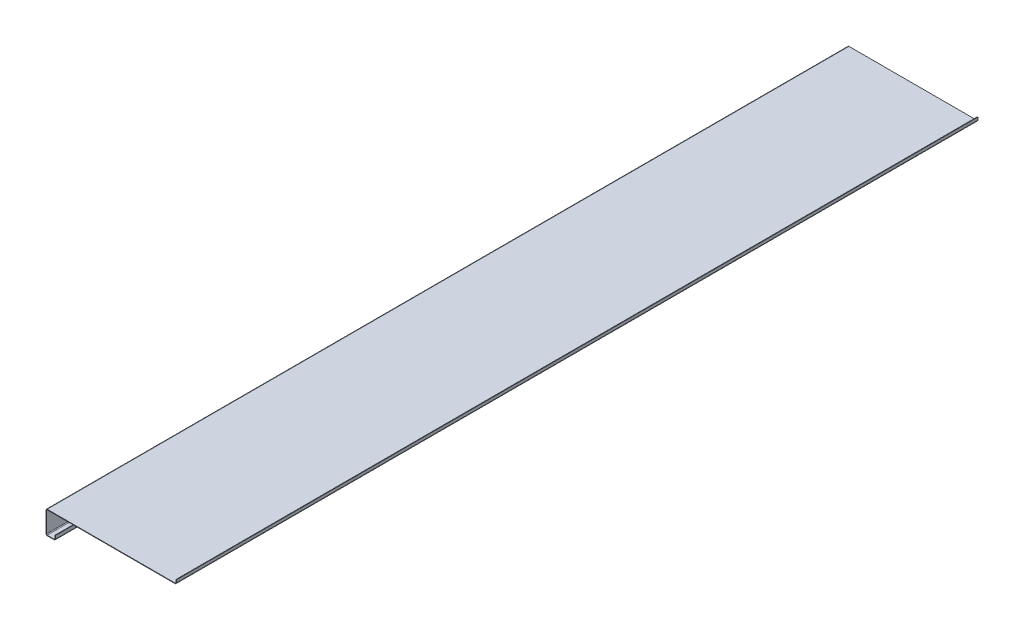
ISO-10303-21;
HEADER;
FILE_DESCRIPTION(('STEP AP214'),'2;1');
FILE_NAME('part.step','',(''),(''),'','','');
FILE_SCHEMA(('AUTOMOTIVE_DESIGN { 1 0 10303 214 1 1 1 1 }'));
ENDSEC;
DATA;
#1=APPLICATION_CONTEXT('core data for automotive mechanical design processes');
#2=APPLICATION_PROTOCOL_DEFINITION('international standard','automotive_design',2000,#1);
#3=PRODUCT_CONTEXT('',#1,'mechanical');
#4=PRODUCT('Part','Part','',(#3));
#5=PRODUCT_RELATED_PRODUCT_CATEGORY('part','',(#4));
#6=PRODUCT_DEFINITION_FORMATION('','',#4);
#7=PRODUCT_DEFINITION_CONTEXT('part definition',#1,'design');
#8=PRODUCT_DEFINITION('design','',#6,#7);
#9=PRODUCT_DEFINITION_SHAPE('','',#8);
#10=(LENGTH_UNIT() NAMED_UNIT(*) SI_UNIT(.MILLI.,.METRE.));
#11=(NAMED_UNIT(*) PLANE_ANGLE_UNIT() SI_UNIT($,.RADIAN.));
#12=(NAMED_UNIT(*) SI_UNIT($,.STERADIAN.) SOLID_ANGLE_UNIT());
#13=UNCERTAINTY_MEASURE_WITH_UNIT(LENGTH_MEASURE(1.E-05),#10,'distance_accuracy_value','');
#14=(GEOMETRIC_REPRESENTATION_CONTEXT(3) GLOBAL_UNCERTAINTY_ASSIGNED_CONTEXT((#13)) GLOBAL_UNIT_ASSIGNED_CONTEXT((#10,
#11,#12)) REPRESENTATION_CONTEXT('',''));
#15=CARTESIAN_POINT('',(0.,0.,0.));
#16=DIRECTION('',(0.,0.,1.));
#17=DIRECTION('',(1.,0.,0.));
#18=AXIS2_PLACEMENT_3D('',#15,#16,#17);
#19=CARTESIAN_POINT('',(-3.25,0.,2080.));
#20=DIRECTION('',(0.,0.,1.));
#21=DIRECTION('',(1.,0.,0.));
#22=AXIS2_PLACEMENT_3D('',#19,#20,#21);
#23=PLANE('',#22);
#24=DIRECTION('',(0.,1.,0.));
#25=VECTOR('',#24,1.);
#26=CARTESIAN_POINT('',(-3.25,0.,2080.));
#27=LINE('',#26,#25);
#28=CARTESIAN_POINT('',(-3.25,0.,2080.));
#29=VERTEX_POINT('',#28);
#30=CARTESIAN_POINT('',(-3.25,1.25,2080.));
#31=VERTEX_POINT('',#30);
#32=EDGE_CURVE('E11',#29,#31,#27,.T.);
#33=ORIENTED_EDGE('',*,*,#32,.F.);
#34=CARTESIAN_POINT('',(-3.25,3.25,2080.));
#35=DIRECTION('',(0.,0.,1.));
#36=DIRECTION('',(1.,0.,0.));
#37=AXIS2_PLACEMENT_3D('',#34,#35,#36);
#38=CIRCLE('',#37,3.25);
#39=CARTESIAN_POINT('',(0.,3.25,2080.));
#40=VERTEX_POINT('',#39);
#41=EDGE_CURVE('E365',#40,#29,#38,.F.);
#42=ORIENTED_EDGE('',*,*,#41,.F.);
#43=DIRECTION('',(1.,0.,0.));
#44=VECTOR('',#43,1.);
#45=CARTESIAN_POINT('',(-1.25,3.25,2080.));
#46=LINE('',#45,#44);
#47=CARTESIAN_POINT('',(-1.25,3.25,2080.));
#48=VERTEX_POINT('',#47);
#49=EDGE_CURVE('E44',#48,#40,#46,.T.);
#50=ORIENTED_EDGE('',*,*,#49,.F.);
#51=CARTESIAN_POINT('',(-3.25,3.25,2080.));
#52=DIRECTION('',(0.,0.,1.));
#53=DIRECTION('',(1.,0.,0.));
#54=AXIS2_PLACEMENT_3D('',#51,#52,#53);
#55=CIRCLE('',#54,2.);
#56=EDGE_CURVE('E378',#48,#31,#55,.F.);
#57=ORIENTED_EDGE('',*,*,#56,.T.);
#58=EDGE_LOOP('',(#33,#42,#50,#57));
#59=FACE_BOUND('',#58,.T.);
#60=ADVANCED_FACE('F36',(#59),#23,.T.);
#61=CARTESIAN_POINT('',(-1.25,3.25,2080.));
#62=DIRECTION('',(0.,0.,1.));
#63=DIRECTION('',(1.,0.,0.));
#64=AXIS2_PLACEMENT_3D('',#61,#62,#63);
#65=PLANE('',#64);
#66=DIRECTION('',(-1.,0.,0.));
#67=VECTOR('',#66,1.);
#68=CARTESIAN_POINT('',(0.,0.,2080.));
#69=LINE('',#68,#67);
#70=CARTESIAN_POINT('',(-334.75,0.,2080.));
#71=VERTEX_POINT('',#70);
#72=EDGE_CURVE('E369',#29,#71,#69,.T.);
#73=ORIENTED_EDGE('',*,*,#72,.F.);
#74=ORIENTED_EDGE('',*,*,#32,.T.);
#75=DIRECTION('',(-1.,0.,0.));
#76=VECTOR('',#75,1.);
#77=CARTESIAN_POINT('',(0.,1.25,2080.));
#78=LINE('',#77,#76);
#79=CARTESIAN_POINT('',(-334.75,1.24999999999996,2080.));
#80=VERTEX_POINT('',#79);
#81=EDGE_CURVE('E380',#31,#80,#78,.T.);
#82=ORIENTED_EDGE('',*,*,#81,.T.);
#83=DIRECTION('',(0.,-1.,0.));
#84=VECTOR('',#83,1.);
#85=CARTESIAN_POINT('',(-334.75,1.24999999999996,2080.));
#86=LINE('',#85,#84);
#87=EDGE_CURVE('E339',#80,#71,#86,.T.);
#88=ORIENTED_EDGE('',*,*,#87,.T.);
#89=EDGE_LOOP('',(#73,#74,#82,#88));
#90=FACE_BOUND('',#89,.T.);
#91=ADVANCED_FACE('F449',(#90),#65,.T.);
#92=CARTESIAN_POINT('',(0.,3.25,0.));
#93=DIRECTION('',(0.,0.,-1.));
#94=DIRECTION('',(-1.,0.,0.));
#95=AXIS2_PLACEMENT_3D('',#92,#93,#94);
#96=PLANE('',#95);
#97=DIRECTION('',(-1.,0.,0.));
#98=VECTOR('',#97,1.);
#99=CARTESIAN_POINT('',(0.,3.25,0.));
#100=LINE('',#99,#98);
#101=CARTESIAN_POINT('',(0.,3.25,0.));
#102=VERTEX_POINT('',#101);
#103=CARTESIAN_POINT('',(-1.25,3.25,0.));
#104=VERTEX_POINT('',#103);
#105=EDGE_CURVE('E345',#102,#104,#100,.T.);
#106=ORIENTED_EDGE('',*,*,#105,.F.);
#107=CARTESIAN_POINT('',(-3.25,3.25,0.));
#108=DIRECTION('',(0.,0.,1.));
#109=DIRECTION('',(1.,0.,0.));
#110=AXIS2_PLACEMENT_3D('',#107,#108,#109);
#111=CIRCLE('',#110,3.25);
#112=CARTESIAN_POINT('',(-3.25,0.,0.));
#113=VERTEX_POINT('',#112);
#114=EDGE_CURVE('E249',#102,#113,#111,.F.);
#115=ORIENTED_EDGE('',*,*,#114,.T.);
#116=DIRECTION('',(0.,-1.,0.));
#117=VECTOR('',#116,1.);
#118=CARTESIAN_POINT('',(-3.25,1.25,0.));
#119=LINE('',#118,#117);
#120=CARTESIAN_POINT('',(-3.25,1.25,0.));
#121=VERTEX_POINT('',#120);
#122=EDGE_CURVE('E343',#121,#113,#119,.T.);
#123=ORIENTED_EDGE('',*,*,#122,.F.);
#124=CARTESIAN_POINT('',(-3.25,3.25,0.));
#125=DIRECTION('',(0.,0.,1.));
#126=DIRECTION('',(1.,0.,0.));
#127=AXIS2_PLACEMENT_3D('',#124,#125,#126);
#128=CIRCLE('',#127,2.);
#129=EDGE_CURVE('E261',#104,#121,#128,.F.);
#130=ORIENTED_EDGE('',*,*,#129,.F.);
#131=EDGE_LOOP('',(#106,#115,#123,#130));
#132=FACE_BOUND('',#131,.T.);
#133=ADVANCED_FACE('F491',(#132),#96,.T.);
#134=CARTESIAN_POINT('',(-3.25,1.25,0.));
#135=DIRECTION('',(0.,0.,-1.));
#136=DIRECTION('',(-1.,0.,0.));
#137=AXIS2_PLACEMENT_3D('',#134,#135,#136);
#138=PLANE('',#137);
#139=DIRECTION('',(0.,-1.,0.));
#140=VECTOR('',#139,1.);
#141=CARTESIAN_POINT('',(0.,10.,0.));
#142=LINE('',#141,#140);
#143=CARTESIAN_POINT('',(0.,10.,0.));
#144=VERTEX_POINT('',#143);
#145=EDGE_CURVE('E252',#144,#102,#142,.T.);
#146=ORIENTED_EDGE('',*,*,#145,.T.);
#147=ORIENTED_EDGE('',*,*,#105,.T.);
#148=DIRECTION('',(0.,-1.,0.));
#149=VECTOR('',#148,1.);
#150=CARTESIAN_POINT('',(-1.25,10.,0.));
#151=LINE('',#150,#149);
#152=CARTESIAN_POINT('',(-1.25,10.,0.));
#153=VERTEX_POINT('',#152);
#154=EDGE_CURVE('E258',#153,#104,#151,.T.);
#155=ORIENTED_EDGE('',*,*,#154,.F.);
#156=DIRECTION('',(1.,0.,0.));
#157=VECTOR('',#156,1.);
#158=CARTESIAN_POINT('',(-1.25,10.,0.));
#159=LINE('',#158,#157);
#160=EDGE_CURVE('E255',#153,#144,#159,.T.);
#161=ORIENTED_EDGE('',*,*,#160,.T.);
#162=EDGE_LOOP('',(#146,#147,#155,#161));
#163=FACE_BOUND('',#162,.T.);
#164=ADVANCED_FACE('F495',(#163),#138,.T.);
#165=CARTESIAN_POINT('',(-336.75,-2.00000000000004,2080.));
#166=DIRECTION('',(0.,0.,1.));
#167=DIRECTION('',(1.,0.,0.));
#168=AXIS2_PLACEMENT_3D('',#165,#166,#167);
#169=PLANE('',#168);
#170=DIRECTION('',(-1.,0.,0.));
#171=VECTOR('',#170,1.);
#172=CARTESIAN_POINT('',(-336.75,-2.00000000000004,2080.));
#173=LINE('',#172,#171);
#174=CARTESIAN_POINT('',(-336.75,-2.00000000000004,2080.));
#175=VERTEX_POINT('',#174);
#176=CARTESIAN_POINT('',(-338.,-2.00000000000004,2080.));
#177=VERTEX_POINT('',#176);
#178=EDGE_CURVE('E341',#175,#177,#173,.T.);
#179=ORIENTED_EDGE('',*,*,#178,.F.);
#180=CARTESIAN_POINT('',(-334.75,-2.00000000000004,2080.));
#181=DIRECTION('',(0.,0.,-1.));
#182=DIRECTION('',(-1.,0.,0.));
#183=AXIS2_PLACEMENT_3D('',#180,#181,#182);
#184=CIRCLE('',#183,2.);
#185=EDGE_CURVE('E439',#71,#175,#184,.F.);
#186=ORIENTED_EDGE('',*,*,#185,.F.);
#187=ORIENTED_EDGE('',*,*,#87,.F.);
#188=CARTESIAN_POINT('',(-334.75,-2.00000000000004,2080.));
#189=DIRECTION('',(0.,0.,1.));
#190=DIRECTION('',(1.,0.,0.));
#191=AXIS2_PLACEMENT_3D('',#188,#189,#190);
#192=CIRCLE('',#191,3.25);
#193=EDGE_CURVE('E383',#80,#177,#192,.T.);
#194=ORIENTED_EDGE('',*,*,#193,.T.);
#195=EDGE_LOOP('',(#179,#186,#187,#194));
#196=FACE_BOUND('',#195,.T.);
#197=ADVANCED_FACE('F456',(#196),#169,.T.);
#198=CARTESIAN_POINT('',(-334.75,1.24999999999996,2080.));
#199=DIRECTION('',(0.,0.,1.));
#200=DIRECTION('',(1.,0.,0.));
#201=AXIS2_PLACEMENT_3D('',#198,#199,#200);
#202=PLANE('',#201);
#203=DIRECTION('',(0.,-1.,0.));
#204=VECTOR('',#203,1.);
#205=CARTESIAN_POINT('',(-336.75,0.,2080.));
#206=LINE('',#205,#204);
#207=CARTESIAN_POINT('',(-336.75,-55.,2080.));
#208=VERTEX_POINT('',#207);
#209=EDGE_CURVE('E436',#175,#208,#206,.T.);
#210=ORIENTED_EDGE('',*,*,#209,.F.);
#211=ORIENTED_EDGE('',*,*,#178,.T.);
#212=DIRECTION('',(0.,-1.,0.));
#213=VECTOR('',#212,1.);
#214=CARTESIAN_POINT('',(-338.,0.,2080.));
#215=LINE('',#214,#213);
#216=CARTESIAN_POINT('',(-338.,-55.,2080.));
#217=VERTEX_POINT('',#216);
#218=EDGE_CURVE('E203',#177,#217,#215,.T.);
#219=ORIENTED_EDGE('',*,*,#218,.T.);
#220=DIRECTION('',(1.,0.,0.));
#221=VECTOR('',#220,1.);
#222=CARTESIAN_POINT('',(-338.,-55.,2080.));
#223=LINE('',#222,#221);
#224=EDGE_CURVE('E194',#217,#208,#223,.T.);
#225=ORIENTED_EDGE('',*,*,#224,.T.);
#226=EDGE_LOOP('',(#210,#211,#219,#225));
#227=FACE_BOUND('',#226,.T.);
#228=ADVANCED_FACE('F389',(#227),#202,.T.);
#229=CARTESIAN_POINT('',(-334.75,0.,0.));
#230=DIRECTION('',(0.,0.,-1.));
#231=DIRECTION('',(-1.,0.,0.));
#232=AXIS2_PLACEMENT_3D('',#229,#230,#231);
#233=PLANE('',#232);
#234=DIRECTION('',(0.,1.,0.));
#235=VECTOR('',#234,1.);
#236=CARTESIAN_POINT('',(-334.75,0.,0.));
#237=LINE('',#236,#235);
#238=CARTESIAN_POINT('',(-334.75,0.,0.));
#239=VERTEX_POINT('',#238);
#240=CARTESIAN_POINT('',(-334.75,1.24999999999996,0.));
#241=VERTEX_POINT('',#240);
#242=EDGE_CURVE('E337',#239,#241,#237,.T.);
#243=ORIENTED_EDGE('',*,*,#242,.F.);
#244=CARTESIAN_POINT('',(-334.75,-2.00000000000004,0.));
#245=DIRECTION('',(0.,0.,-1.));
#246=DIRECTION('',(-1.,0.,0.));
#247=AXIS2_PLACEMENT_3D('',#244,#245,#246);
#248=CIRCLE('',#247,2.);
#249=CARTESIAN_POINT('',(-336.75,-2.00000000000004,0.));
#250=VERTEX_POINT('',#249);
#251=EDGE_CURVE('E243',#239,#250,#248,.F.);
#252=ORIENTED_EDGE('',*,*,#251,.T.);
#253=DIRECTION('',(1.,0.,0.));
#254=VECTOR('',#253,1.);
#255=CARTESIAN_POINT('',(-338.,-2.00000000000004,0.));
#256=LINE('',#255,#254);
#257=CARTESIAN_POINT('',(-338.,-2.00000000000004,0.));
#258=VERTEX_POINT('',#257);
#259=EDGE_CURVE('E193',#258,#250,#256,.T.);
#260=ORIENTED_EDGE('',*,*,#259,.F.);
#261=CARTESIAN_POINT('',(-334.75,-2.00000000000004,0.));
#262=DIRECTION('',(0.,0.,1.));
#263=DIRECTION('',(1.,0.,0.));
#264=AXIS2_PLACEMENT_3D('',#261,#262,#263);
#265=CIRCLE('',#264,3.25);
#266=EDGE_CURVE('E267',#241,#258,#265,.T.);
#267=ORIENTED_EDGE('',*,*,#266,.F.);
#268=EDGE_LOOP('',(#243,#252,#260,#267));
#269=FACE_BOUND('',#268,.T.);
#270=ADVANCED_FACE('F465',(#269),#233,.T.);
#271=CARTESIAN_POINT('',(-338.,-2.00000000000004,0.));
#272=DIRECTION('',(0.,0.,-1.));
#273=DIRECTION('',(-1.,0.,0.));
#274=AXIS2_PLACEMENT_3D('',#271,#272,#273);
#275=PLANE('',#274);
#276=DIRECTION('',(-1.,0.,0.));
#277=VECTOR('',#276,1.);
#278=CARTESIAN_POINT('',(0.,0.,0.));
#279=LINE('',#278,#277);
#280=EDGE_CURVE('E246',#113,#239,#279,.T.);
#281=ORIENTED_EDGE('',*,*,#280,.T.);
#282=ORIENTED_EDGE('',*,*,#242,.T.);
#283=DIRECTION('',(-1.,0.,0.));
#284=VECTOR('',#283,1.);
#285=CARTESIAN_POINT('',(0.,1.25,0.));
#286=LINE('',#285,#284);
#287=EDGE_CURVE('E264',#121,#241,#286,.T.);
#288=ORIENTED_EDGE('',*,*,#287,.F.);
#289=ORIENTED_EDGE('',*,*,#122,.T.);
#290=EDGE_LOOP('',(#281,#282,#288,#289));
#291=FACE_BOUND('',#290,.T.);
#292=ADVANCED_FACE('F469',(#291),#275,.T.);
#293=CARTESIAN_POINT('',(-334.75,-57.,2080.));
#294=DIRECTION('',(0.,0.,1.));
#295=DIRECTION('',(1.,0.,0.));
#296=AXIS2_PLACEMENT_3D('',#293,#294,#295);
#297=PLANE('',#296);
#298=DIRECTION('',(0.,-1.,0.));
#299=VECTOR('',#298,1.);
#300=CARTESIAN_POINT('',(-334.75,-57.,2080.));
#301=LINE('',#300,#299);
#302=CARTESIAN_POINT('',(-334.75,-57.,2080.));
#303=VERTEX_POINT('',#302);
#304=CARTESIAN_POINT('',(-334.75,-58.25,2080.));
#305=VERTEX_POINT('',#304);
#306=EDGE_CURVE('E181',#303,#305,#301,.T.);
#307=ORIENTED_EDGE('',*,*,#306,.F.);
#308=CARTESIAN_POINT('',(-334.75,-55.,2080.));
#309=DIRECTION('',(0.,0.,-1.));
#310=DIRECTION('',(-1.,0.,0.));
#311=AXIS2_PLACEMENT_3D('',#308,#309,#310);
#312=CIRCLE('',#311,2.);
#313=EDGE_CURVE('E401',#208,#303,#312,.F.);
#314=ORIENTED_EDGE('',*,*,#313,.F.);
#315=ORIENTED_EDGE('',*,*,#224,.F.);
#316=CARTESIAN_POINT('',(-334.75,-55.,2080.));
#317=DIRECTION('',(0.,0.,1.));
#318=DIRECTION('',(1.,0.,0.));
#319=AXIS2_PLACEMENT_3D('',#316,#317,#318);
#320=CIRCLE('',#319,3.25);
#321=EDGE_CURVE('E197',#217,#305,#320,.T.);
#322=ORIENTED_EDGE('',*,*,#321,.T.);
#323=EDGE_LOOP('',(#307,#314,#315,#322));
#324=FACE_BOUND('',#323,.T.);
#325=ADVANCED_FACE('F199',(#324),#297,.T.);
#326=CARTESIAN_POINT('',(-338.,-55.,2080.));
#327=DIRECTION('',(0.,0.,1.));
#328=DIRECTION('',(1.,0.,0.));
#329=AXIS2_PLACEMENT_3D('',#326,#327,#328);
#330=PLANE('',#329);
#331=DIRECTION('',(1.,0.,0.));
#332=VECTOR('',#331,1.);
#333=CARTESIAN_POINT('',(-336.75,-57.,2080.));
#334=LINE('',#333,#332);
#335=CARTESIAN_POINT('',(-316.75,-57.,2080.));
#336=VERTEX_POINT('',#335);
#337=EDGE_CURVE('E188',#303,#336,#334,.T.);
#338=ORIENTED_EDGE('',*,*,#337,.F.);
#339=ORIENTED_EDGE('',*,*,#306,.T.);
#340=DIRECTION('',(1.,0.,0.));
#341=VECTOR('',#340,1.);
#342=CARTESIAN_POINT('',(-336.75,-58.25,2080.));
#343=LINE('',#342,#341);
#344=CARTESIAN_POINT('',(-316.75,-58.25,2080.));
#345=VERTEX_POINT('',#344);
#346=EDGE_CURVE('E185',#305,#345,#343,.T.);
#347=ORIENTED_EDGE('',*,*,#346,.T.);
#348=DIRECTION('',(0.,1.,0.));
#349=VECTOR('',#348,1.);
#350=CARTESIAN_POINT('',(-316.75,-58.25,2080.));
#351=LINE('',#350,#349);
#352=EDGE_CURVE('E328',#345,#336,#351,.T.);
#353=ORIENTED_EDGE('',*,*,#352,.T.);
#354=EDGE_LOOP('',(#338,#339,#347,#353));
#355=FACE_BOUND('',#354,.T.);
#356=ADVANCED_FACE('F183',(#355),#330,.T.);
#357=CARTESIAN_POINT('',(-336.75,-55.,0.));
#358=DIRECTION('',(0.,0.,-1.));
#359=DIRECTION('',(-1.,0.,0.));
#360=AXIS2_PLACEMENT_3D('',#357,#358,#359);
#361=PLANE('',#360);
#362=DIRECTION('',(-1.,0.,0.));
#363=VECTOR('',#362,1.);
#364=CARTESIAN_POINT('',(-336.75,-55.,0.));
#365=LINE('',#364,#363);
#366=CARTESIAN_POINT('',(-336.75,-55.,0.));
#367=VERTEX_POINT('',#366);
#368=CARTESIAN_POINT('',(-338.,-55.,0.));
#369=VERTEX_POINT('',#368);
#370=EDGE_CURVE('E333',#367,#369,#365,.T.);
#371=ORIENTED_EDGE('',*,*,#370,.F.);
#372=CARTESIAN_POINT('',(-334.75,-55.,0.));
#373=DIRECTION('',(0.,0.,-1.));
#374=DIRECTION('',(-1.,0.,0.));
#375=AXIS2_PLACEMENT_3D('',#372,#373,#374);
#376=CIRCLE('',#375,2.);
#377=CARTESIAN_POINT('',(-334.75,-57.,0.));
#378=VERTEX_POINT('',#377);
#379=EDGE_CURVE('E237',#367,#378,#376,.F.);
#380=ORIENTED_EDGE('',*,*,#379,.T.);
#381=DIRECTION('',(0.,1.,0.));
#382=VECTOR('',#381,1.);
#383=CARTESIAN_POINT('',(-334.75,-58.25,0.));
#384=LINE('',#383,#382);
#385=CARTESIAN_POINT('',(-334.75,-58.25,0.));
#386=VERTEX_POINT('',#385);
#387=EDGE_CURVE('E331',#386,#378,#384,.T.);
#388=ORIENTED_EDGE('',*,*,#387,.F.);
#389=CARTESIAN_POINT('',(-334.75,-55.,0.));
#390=DIRECTION('',(0.,0.,1.));
#391=DIRECTION('',(1.,0.,0.));
#392=AXIS2_PLACEMENT_3D('',#389,#390,#391);
#393=CIRCLE('',#392,3.25);
#394=EDGE_CURVE('E210',#369,#386,#393,.T.);
#395=ORIENTED_EDGE('',*,*,#394,.F.);
#396=EDGE_LOOP('',(#371,#380,#388,#395));
#397=FACE_BOUND('',#396,.T.);
#398=ADVANCED_FACE('F395',(#397),#361,.T.);
#399=CARTESIAN_POINT('',(-334.75,-58.25,0.));
#400=DIRECTION('',(0.,0.,-1.));
#401=DIRECTION('',(-1.,0.,0.));
#402=AXIS2_PLACEMENT_3D('',#399,#400,#401);
#403=PLANE('',#402);
#404=DIRECTION('',(0.,-1.,0.));
#405=VECTOR('',#404,1.);
#406=CARTESIAN_POINT('',(-336.75,0.,0.));
#407=LINE('',#406,#405);
#408=EDGE_CURVE('E240',#250,#367,#407,.T.);
#409=ORIENTED_EDGE('',*,*,#408,.T.);
#410=ORIENTED_EDGE('',*,*,#370,.T.);
#411=DIRECTION('',(0.,-1.,0.));
#412=VECTOR('',#411,1.);
#413=CARTESIAN_POINT('',(-338.,0.,0.));
#414=LINE('',#413,#412);
#415=EDGE_CURVE('E270',#258,#369,#414,.T.);
#416=ORIENTED_EDGE('',*,*,#415,.F.);
#417=ORIENTED_EDGE('',*,*,#259,.T.);
#418=EDGE_LOOP('',(#409,#410,#416,#417));
#419=FACE_BOUND('',#418,.T.);
#420=ADVANCED_FACE('F475',(#419),#403,.T.);
#421=CARTESIAN_POINT('',(-314.75,-55.,2080.));
#422=DIRECTION('',(0.,0.,1.));
#423=DIRECTION('',(1.,0.,0.));
#424=AXIS2_PLACEMENT_3D('',#421,#422,#423);
#425=PLANE('',#424);
#426=DIRECTION('',(1.,0.,0.));
#427=VECTOR('',#426,1.);
#428=CARTESIAN_POINT('',(-314.75,-55.,2080.));
#429=LINE('',#428,#427);
#430=CARTESIAN_POINT('',(-314.75,-55.,2080.));
#431=VERTEX_POINT('',#430);
#432=CARTESIAN_POINT('',(-313.5,-55.,2080.));
#433=VERTEX_POINT('',#432);
#434=EDGE_CURVE('E52',#431,#433,#429,.T.);
#435=ORIENTED_EDGE('',*,*,#434,.F.);
#436=CARTESIAN_POINT('',(-316.75,-55.,2080.));
#437=DIRECTION('',(0.,0.,-1.));
#438=DIRECTION('',(-1.,0.,0.));
#439=AXIS2_PLACEMENT_3D('',#436,#437,#438);
#440=CIRCLE('',#439,2.);
#441=EDGE_CURVE('E429',#336,#431,#440,.F.);
#442=ORIENTED_EDGE('',*,*,#441,.F.);
#443=ORIENTED_EDGE('',*,*,#352,.F.);
#444=CARTESIAN_POINT('',(-316.75,-55.,2080.));
#445=DIRECTION('',(0.,0.,1.));
#446=DIRECTION('',(1.,0.,0.));
#447=AXIS2_PLACEMENT_3D('',#444,#445,#446);
#448=CIRCLE('',#447,3.25);
#449=EDGE_CURVE('E218',#345,#433,#448,.T.);
#450=ORIENTED_EDGE('',*,*,#449,.T.);
#451=EDGE_LOOP('',(#435,#442,#443,#450));
#452=FACE_BOUND('',#451,.T.);
#453=ADVANCED_FACE('F477',(#452),#425,.T.);
#454=CARTESIAN_POINT('',(-316.75,-58.25,2080.));
#455=DIRECTION('',(0.,0.,1.));
#456=DIRECTION('',(1.,0.,0.));
#457=AXIS2_PLACEMENT_3D('',#454,#455,#456);
#458=PLANE('',#457);
#459=DIRECTION('',(0.,1.,0.));
#460=VECTOR('',#459,1.);
#461=CARTESIAN_POINT('',(-314.75,-57.,2080.));
#462=LINE('',#461,#460);
#463=CARTESIAN_POINT('',(-314.75,-47.,2080.));
#464=VERTEX_POINT('',#463);
#465=EDGE_CURVE('E427',#431,#464,#462,.T.);
#466=ORIENTED_EDGE('',*,*,#465,.F.);
#467=ORIENTED_EDGE('',*,*,#434,.T.);
#468=DIRECTION('',(0.,1.,0.));
#469=VECTOR('',#468,1.);
#470=CARTESIAN_POINT('',(-313.5,-57.,2080.));
#471=LINE('',#470,#469);
#472=CARTESIAN_POINT('',(-313.5,-47.,2080.));
#473=VERTEX_POINT('',#472);
#474=EDGE_CURVE('E130',#433,#473,#471,.T.);
#475=ORIENTED_EDGE('',*,*,#474,.T.);
#476=DIRECTION('',(1.,0.,0.));
#477=VECTOR('',#476,1.);
#478=CARTESIAN_POINT('',(-314.75,-47.,2080.));
#479=LINE('',#478,#477);
#480=EDGE_CURVE('E425',#464,#473,#479,.T.);
#481=ORIENTED_EDGE('',*,*,#480,.F.);
#482=EDGE_LOOP('',(#466,#467,#475,#481));
#483=FACE_BOUND('',#482,.T.);
#484=ADVANCED_FACE('F483',(#483),#458,.T.);
#485=CARTESIAN_POINT('',(-316.75,-57.,0.));
#486=DIRECTION('',(0.,0.,-1.));
#487=DIRECTION('',(-1.,0.,0.));
#488=AXIS2_PLACEMENT_3D('',#485,#486,#487);
#489=PLANE('',#488);
#490=DIRECTION('',(0.,-1.,0.));
#491=VECTOR('',#490,1.);
#492=CARTESIAN_POINT('',(-316.75,-57.,0.));
#493=LINE('',#492,#491);
#494=CARTESIAN_POINT('',(-316.75,-57.,0.));
#495=VERTEX_POINT('',#494);
#496=CARTESIAN_POINT('',(-316.75,-58.25,0.));
#497=VERTEX_POINT('',#496);
#498=EDGE_CURVE('E117',#495,#497,#493,.T.);
#499=ORIENTED_EDGE('',*,*,#498,.F.);
#500=CARTESIAN_POINT('',(-316.75,-55.,0.));
#501=DIRECTION('',(0.,0.,-1.));
#502=DIRECTION('',(-1.,0.,0.));
#503=AXIS2_PLACEMENT_3D('',#500,#501,#502);
#504=CIRCLE('',#503,2.);
#505=CARTESIAN_POINT('',(-314.75,-55.,0.));
#506=VERTEX_POINT('',#505);
#507=EDGE_CURVE('E233',#495,#506,#504,.F.);
#508=ORIENTED_EDGE('',*,*,#507,.T.);
#509=DIRECTION('',(-1.,0.,0.));
#510=VECTOR('',#509,1.);
#511=CARTESIAN_POINT('',(-313.5,-55.,0.));
#512=LINE('',#511,#510);
#513=CARTESIAN_POINT('',(-313.5,-55.,0.));
#514=VERTEX_POINT('',#513);
#515=EDGE_CURVE('E124',#514,#506,#512,.T.);
#516=ORIENTED_EDGE('',*,*,#515,.F.);
#517=CARTESIAN_POINT('',(-316.75,-55.,0.));
#518=DIRECTION('',(0.,0.,1.));
#519=DIRECTION('',(1.,0.,0.));
#520=AXIS2_PLACEMENT_3D('',#517,#518,#519);
#521=CIRCLE('',#520,3.25);
#522=EDGE_CURVE('E276',#497,#514,#521,.T.);
#523=ORIENTED_EDGE('',*,*,#522,.F.);
#524=EDGE_LOOP('',(#499,#508,#516,#523));
#525=FACE_BOUND('',#524,.T.);
#526=ADVANCED_FACE('F412',(#525),#489,.T.);
#527=CARTESIAN_POINT('',(-313.5,-55.,0.));
#528=DIRECTION('',(0.,0.,-1.));
#529=DIRECTION('',(-1.,0.,0.));
#530=AXIS2_PLACEMENT_3D('',#527,#528,#529);
#531=PLANE('',#530);
#532=DIRECTION('',(1.,0.,0.));
#533=VECTOR('',#532,1.);
#534=CARTESIAN_POINT('',(-336.75,-57.,0.));
#535=LINE('',#534,#533);
#536=EDGE_CURVE('E235',#378,#495,#535,.T.);
#537=ORIENTED_EDGE('',*,*,#536,.T.);
#538=ORIENTED_EDGE('',*,*,#498,.T.);
#539=DIRECTION('',(1.,0.,0.));
#540=VECTOR('',#539,1.);
#541=CARTESIAN_POINT('',(-336.75,-58.25,0.));
#542=LINE('',#541,#540);
#543=EDGE_CURVE('E274',#386,#497,#542,.T.);
#544=ORIENTED_EDGE('',*,*,#543,.F.);
#545=ORIENTED_EDGE('',*,*,#387,.T.);
#546=EDGE_LOOP('',(#537,#538,#544,#545));
#547=FACE_BOUND('',#546,.T.);
#548=ADVANCED_FACE('F397',(#547),#531,.T.);
#549=CARTESIAN_POINT('',(-313.5,-57.,2080.));
#550=DIRECTION('',(-1.,0.,0.));
#551=DIRECTION('',(0.,0.,1.));
#552=AXIS2_PLACEMENT_3D('',#549,#550,#551);
#553=PLANE('',#552);
#554=DIRECTION('',(0.,1.,0.));
#555=VECTOR('',#554,1.);
#556=CARTESIAN_POINT('',(-313.5,-57.,0.));
#557=LINE('',#556,#555);
#558=CARTESIAN_POINT('',(-313.5,-47.,0.));
#559=VERTEX_POINT('',#558);
#560=EDGE_CURVE('E224',#514,#559,#557,.T.);
#561=ORIENTED_EDGE('',*,*,#560,.T.);
#562=DIRECTION('',(0.,0.,-1.));
#563=VECTOR('',#562,1.);
#564=CARTESIAN_POINT('',(-313.5,-47.,2080.));
#565=LINE('',#564,#563);
#566=EDGE_CURVE('E324',#473,#559,#565,.T.);
#567=ORIENTED_EDGE('',*,*,#566,.F.);
#568=ORIENTED_EDGE('',*,*,#474,.F.);
#569=DIRECTION('',(0.,0.,-1.));
#570=VECTOR('',#569,1.);
#571=CARTESIAN_POINT('',(-313.5,-55.,2080.));
#572=LINE('',#571,#570);
#573=EDGE_CURVE('E220',#433,#514,#572,.T.);
#574=ORIENTED_EDGE('',*,*,#573,.T.);
#575=EDGE_LOOP('',(#561,#567,#568,#574));
#576=FACE_BOUND('',#575,.T.);
#577=ADVANCED_FACE('F418',(#576),#553,.F.);
#578=CARTESIAN_POINT('',(-314.75,-47.,2080.));
#579=DIRECTION('',(0.,1.,0.));
#580=DIRECTION('',(0.,0.,1.));
#581=AXIS2_PLACEMENT_3D('',#578,#579,#580);
#582=PLANE('',#581);
#583=DIRECTION('',(1.,0.,0.));
#584=VECTOR('',#583,1.);
#585=CARTESIAN_POINT('',(-314.75,-47.,0.));
#586=LINE('',#585,#584);
#587=CARTESIAN_POINT('',(-314.75,-47.,0.));
#588=VERTEX_POINT('',#587);
#589=EDGE_CURVE('E227',#588,#559,#586,.T.);
#590=ORIENTED_EDGE('',*,*,#589,.F.);
#591=DIRECTION('',(0.,0.,-1.));
#592=VECTOR('',#591,1.);
#593=CARTESIAN_POINT('',(-314.75,-47.,2080.));
#594=LINE('',#593,#592);
#595=EDGE_CURVE('E322',#464,#588,#594,.T.);
#596=ORIENTED_EDGE('',*,*,#595,.F.);
#597=ORIENTED_EDGE('',*,*,#480,.T.);
#598=ORIENTED_EDGE('',*,*,#566,.T.);
#599=EDGE_LOOP('',(#590,#596,#597,#598));
#600=FACE_BOUND('',#599,.T.);
#601=ADVANCED_FACE('F423',(#600),#582,.T.);
#602=CARTESIAN_POINT('',(-314.75,-57.,2080.));
#603=DIRECTION('',(-1.,0.,0.));
#604=DIRECTION('',(0.,0.,1.));
#605=AXIS2_PLACEMENT_3D('',#602,#603,#604);
#606=PLANE('',#605);
#607=DIRECTION('',(0.,1.,0.));
#608=VECTOR('',#607,1.);
#609=CARTESIAN_POINT('',(-314.75,-57.,0.));
#610=LINE('',#609,#608);
#611=EDGE_CURVE('E230',#506,#588,#610,.T.);
#612=ORIENTED_EDGE('',*,*,#611,.F.);
#613=DIRECTION('',(0.,0.,-1.));
#614=VECTOR('',#613,1.);
#615=CARTESIAN_POINT('',(-314.75,-55.,2080.));
#616=LINE('',#615,#614);
#617=EDGE_CURVE('E319',#431,#506,#616,.T.);
#618=ORIENTED_EDGE('',*,*,#617,.F.);
#619=ORIENTED_EDGE('',*,*,#465,.T.);
#620=ORIENTED_EDGE('',*,*,#595,.T.);
#621=EDGE_LOOP('',(#612,#618,#619,#620));
#622=FACE_BOUND('',#621,.T.);
#623=ADVANCED_FACE('F579',(#622),#606,.T.);
#624=CARTESIAN_POINT('',(-316.75,-55.,2080.));
#625=DIRECTION('',(0.,0.,-1.));
#626=DIRECTION('',(-1.,0.,0.));
#627=AXIS2_PLACEMENT_3D('',#624,#625,#626);
#628=CYLINDRICAL_SURFACE('',#627,2.);
#629=ORIENTED_EDGE('',*,*,#507,.F.);
#630=DIRECTION('',(0.,0.,-1.));
#631=VECTOR('',#630,1.);
#632=CARTESIAN_POINT('',(-316.75,-57.,2080.));
#633=LINE('',#632,#631);
#634=EDGE_CURVE('E316',#336,#495,#633,.T.);
#635=ORIENTED_EDGE('',*,*,#634,.F.);
#636=ORIENTED_EDGE('',*,*,#441,.T.);
#637=ORIENTED_EDGE('',*,*,#617,.T.);
#638=EDGE_LOOP('',(#629,#635,#636,#637));
#639=FACE_BOUND('',#638,.T.);
#640=ADVANCED_FACE('F409',(#639),#628,.F.);
#641=CARTESIAN_POINT('',(-336.75,-57.,2080.));
#642=DIRECTION('',(0.,1.,0.));
#643=DIRECTION('',(-1.,0.,0.));
#644=AXIS2_PLACEMENT_3D('',#641,#642,#643);
#645=PLANE('',#644);
#646=ORIENTED_EDGE('',*,*,#536,.F.);
#647=DIRECTION('',(0.,0.,-1.));
#648=VECTOR('',#647,1.);
#649=CARTESIAN_POINT('',(-334.75,-57.,2080.));
#650=LINE('',#649,#648);
#651=EDGE_CURVE('E313',#303,#378,#650,.T.);
#652=ORIENTED_EDGE('',*,*,#651,.F.);
#653=ORIENTED_EDGE('',*,*,#337,.T.);
#654=ORIENTED_EDGE('',*,*,#634,.T.);
#655=EDGE_LOOP('',(#646,#652,#653,#654));
#656=FACE_BOUND('',#655,.T.);
#657=ADVANCED_FACE('F403',(#656),#645,.T.);
#658=CARTESIAN_POINT('',(-334.75,-55.,2080.));
#659=DIRECTION('',(0.,0.,-1.));
#660=DIRECTION('',(-1.,0.,0.));
#661=AXIS2_PLACEMENT_3D('',#658,#659,#660);
#662=CYLINDRICAL_SURFACE('',#661,2.);
#663=ORIENTED_EDGE('',*,*,#379,.F.);
#664=DIRECTION('',(0.,0.,-1.));
#665=VECTOR('',#664,1.);
#666=CARTESIAN_POINT('',(-336.75,-55.,2080.));
#667=LINE('',#666,#665);
#668=EDGE_CURVE('E310',#208,#367,#667,.T.);
#669=ORIENTED_EDGE('',*,*,#668,.F.);
#670=ORIENTED_EDGE('',*,*,#313,.T.);
#671=ORIENTED_EDGE('',*,*,#651,.T.);
#672=EDGE_LOOP('',(#663,#669,#670,#671));
#673=FACE_BOUND('',#672,.T.);
#674=ADVANCED_FACE('F400',(#673),#662,.F.);
#675=CARTESIAN_POINT('',(-336.75,0.,2080.));
#676=DIRECTION('',(1.,0.,0.));
#677=DIRECTION('',(0.,1.,0.));
#678=AXIS2_PLACEMENT_3D('',#675,#676,#677);
#679=PLANE('',#678);
#680=ORIENTED_EDGE('',*,*,#408,.F.);
#681=DIRECTION('',(0.,0.,-1.));
#682=VECTOR('',#681,1.);
#683=CARTESIAN_POINT('',(-336.75,-2.00000000000004,2080.));
#684=LINE('',#683,#682);
#685=EDGE_CURVE('E307',#175,#250,#684,.T.);
#686=ORIENTED_EDGE('',*,*,#685,.F.);
#687=ORIENTED_EDGE('',*,*,#209,.T.);
#688=ORIENTED_EDGE('',*,*,#668,.T.);
#689=EDGE_LOOP('',(#680,#686,#687,#688));
#690=FACE_BOUND('',#689,.T.);
#691=ADVANCED_FACE('F462',(#690),#679,.T.);
#692=CARTESIAN_POINT('',(-334.75,-2.00000000000004,2080.));
#693=DIRECTION('',(0.,0.,-1.));
#694=DIRECTION('',(-1.,0.,0.));
#695=AXIS2_PLACEMENT_3D('',#692,#693,#694);
#696=CYLINDRICAL_SURFACE('',#695,2.);
#697=ORIENTED_EDGE('',*,*,#251,.F.);
#698=DIRECTION('',(0.,0.,-1.));
#699=VECTOR('',#698,1.);
#700=CARTESIAN_POINT('',(-334.75,0.,2080.));
#701=LINE('',#700,#699);
#702=EDGE_CURVE('E304',#71,#239,#701,.T.);
#703=ORIENTED_EDGE('',*,*,#702,.F.);
#704=ORIENTED_EDGE('',*,*,#185,.T.);
#705=ORIENTED_EDGE('',*,*,#685,.T.);
#706=EDGE_LOOP('',(#697,#703,#704,#705));
#707=FACE_BOUND('',#706,.T.);
#708=ADVANCED_FACE('F455',(#707),#696,.F.);
#709=CARTESIAN_POINT('',(0.,0.,2080.));
#710=DIRECTION('',(0.,-1.,0.));
#711=DIRECTION('',(1.,0.,0.));
#712=AXIS2_PLACEMENT_3D('',#709,#710,#711);
#713=PLANE('',#712);
#714=ORIENTED_EDGE('',*,*,#280,.F.);
#715=DIRECTION('',(0.,0.,-1.));
#716=VECTOR('',#715,1.);
#717=CARTESIAN_POINT('',(-3.25,0.,2080.));
#718=LINE('',#717,#716);
#719=EDGE_CURVE('E301',#29,#113,#718,.T.);
#720=ORIENTED_EDGE('',*,*,#719,.F.);
#721=ORIENTED_EDGE('',*,*,#72,.T.);
#722=ORIENTED_EDGE('',*,*,#702,.T.);
#723=EDGE_LOOP('',(#714,#720,#721,#722));
#724=FACE_BOUND('',#723,.T.);
#725=ADVANCED_FACE('F445',(#724),#713,.T.);
#726=CARTESIAN_POINT('',(-3.25,3.25,2080.));
#727=DIRECTION('',(0.,0.,-1.));
#728=DIRECTION('',(-1.,0.,0.));
#729=AXIS2_PLACEMENT_3D('',#726,#727,#728);
#730=CYLINDRICAL_SURFACE('',#729,3.25);
#731=ORIENTED_EDGE('',*,*,#114,.F.);
#732=DIRECTION('',(0.,0.,-1.));
#733=VECTOR('',#732,1.);
#734=CARTESIAN_POINT('',(0.,3.25,2080.));
#735=LINE('',#734,#733);
#736=EDGE_CURVE('E298',#40,#102,#735,.T.);
#737=ORIENTED_EDGE('',*,*,#736,.F.);
#738=ORIENTED_EDGE('',*,*,#41,.T.);
#739=ORIENTED_EDGE('',*,*,#719,.T.);
#740=EDGE_LOOP('',(#731,#737,#738,#739));
#741=FACE_BOUND('',#740,.T.);
#742=ADVANCED_FACE('F364',(#741),#730,.T.);
#743=CARTESIAN_POINT('',(0.,10.,2080.));
#744=DIRECTION('',(1.,0.,0.));
#745=DIRECTION('',(0.,1.,0.));
#746=AXIS2_PLACEMENT_3D('',#743,#744,#745);
#747=PLANE('',#746);
#748=ORIENTED_EDGE('',*,*,#145,.F.);
#749=DIRECTION('',(0.,0.,-1.));
#750=VECTOR('',#749,1.);
#751=CARTESIAN_POINT('',(0.,10.,2080.));
#752=LINE('',#751,#750);
#753=CARTESIAN_POINT('',(0.,10.,2080.));
#754=VERTEX_POINT('',#753);
#755=EDGE_CURVE('E296',#754,#144,#752,.T.);
#756=ORIENTED_EDGE('',*,*,#755,.F.);
#757=DIRECTION('',(0.,-1.,0.));
#758=VECTOR('',#757,1.);
#759=CARTESIAN_POINT('',(0.,10.,2080.));
#760=LINE('',#759,#758);
#761=EDGE_CURVE('E353',#754,#40,#760,.T.);
#762=ORIENTED_EDGE('',*,*,#761,.T.);
#763=ORIENTED_EDGE('',*,*,#736,.T.);
#764=EDGE_LOOP('',(#748,#756,#762,#763));
#765=FACE_BOUND('',#764,.T.);
#766=ADVANCED_FACE('F371',(#765),#747,.T.);
#767=CARTESIAN_POINT('',(-1.25,10.,2080.));
#768=DIRECTION('',(0.,1.,0.));
#769=DIRECTION('',(0.,0.,1.));
#770=AXIS2_PLACEMENT_3D('',#767,#768,#769);
#771=PLANE('',#770);
#772=ORIENTED_EDGE('',*,*,#160,.F.);
#773=DIRECTION('',(0.,0.,-1.));
#774=VECTOR('',#773,1.);
#775=CARTESIAN_POINT('',(-1.25,10.,2080.));
#776=LINE('',#775,#774);
#777=CARTESIAN_POINT('',(-1.25,10.,2080.));
#778=VERTEX_POINT('',#777);
#779=EDGE_CURVE('E294',#778,#153,#776,.T.);
#780=ORIENTED_EDGE('',*,*,#779,.F.);
#781=DIRECTION('',(1.,0.,0.));
#782=VECTOR('',#781,1.);
#783=CARTESIAN_POINT('',(-1.25,10.,2080.));
#784=LINE('',#783,#782);
#785=EDGE_CURVE('E372',#778,#754,#784,.T.);
#786=ORIENTED_EDGE('',*,*,#785,.T.);
#787=ORIENTED_EDGE('',*,*,#755,.T.);
#788=EDGE_LOOP('',(#772,#780,#786,#787));
#789=FACE_BOUND('',#788,.T.);
#790=ADVANCED_FACE('F662',(#789),#771,.T.);
#791=CARTESIAN_POINT('',(-1.25,10.,2080.));
#792=DIRECTION('',(1.,0.,0.));
#793=DIRECTION('',(0.,1.,0.));
#794=AXIS2_PLACEMENT_3D('',#791,#792,#793);
#795=PLANE('',#794);
#796=ORIENTED_EDGE('',*,*,#154,.T.);
#797=DIRECTION('',(0.,0.,-1.));
#798=VECTOR('',#797,1.);
#799=CARTESIAN_POINT('',(-1.25,3.25,2080.));
#800=LINE('',#799,#798);
#801=EDGE_CURVE('E291',#48,#104,#800,.T.);
#802=ORIENTED_EDGE('',*,*,#801,.F.);
#803=DIRECTION('',(0.,-1.,0.));
#804=VECTOR('',#803,1.);
#805=CARTESIAN_POINT('',(-1.25,10.,2080.));
#806=LINE('',#805,#804);
#807=EDGE_CURVE('E356',#778,#48,#806,.T.);
#808=ORIENTED_EDGE('',*,*,#807,.F.);
#809=ORIENTED_EDGE('',*,*,#779,.T.);
#810=EDGE_LOOP('',(#796,#802,#808,#809));
#811=FACE_BOUND('',#810,.T.);
#812=ADVANCED_FACE('F672',(#811),#795,.F.);
#813=CARTESIAN_POINT('',(-3.25,3.25,2080.));
#814=DIRECTION('',(0.,0.,-1.));
#815=DIRECTION('',(-1.,0.,0.));
#816=AXIS2_PLACEMENT_3D('',#813,#814,#815);
#817=CYLINDRICAL_SURFACE('',#816,2.);
#818=ORIENTED_EDGE('',*,*,#129,.T.);
#819=DIRECTION('',(0.,0.,-1.));
#820=VECTOR('',#819,1.);
#821=CARTESIAN_POINT('',(-3.25,1.25,2080.));
#822=LINE('',#821,#820);
#823=EDGE_CURVE('E288',#31,#121,#822,.T.);
#824=ORIENTED_EDGE('',*,*,#823,.F.);
#825=ORIENTED_EDGE('',*,*,#56,.F.);
#826=ORIENTED_EDGE('',*,*,#801,.T.);
#827=EDGE_LOOP('',(#818,#824,#825,#826));
#828=FACE_BOUND('',#827,.T.);
#829=ADVANCED_FACE('F683',(#828),#817,.F.);
#830=CARTESIAN_POINT('',(0.,1.25,2080.));
#831=DIRECTION('',(0.,-1.,0.));
#832=DIRECTION('',(1.,0.,0.));
#833=AXIS2_PLACEMENT_3D('',#830,#831,#832);
#834=PLANE('',#833);
#835=ORIENTED_EDGE('',*,*,#287,.T.);
#836=DIRECTION('',(0.,0.,-1.));
#837=VECTOR('',#836,1.);
#838=CARTESIAN_POINT('',(-334.75,1.24999999999996,2080.));
#839=LINE('',#838,#837);
#840=EDGE_CURVE('E285',#80,#241,#839,.T.);
#841=ORIENTED_EDGE('',*,*,#840,.F.);
#842=ORIENTED_EDGE('',*,*,#81,.F.);
#843=ORIENTED_EDGE('',*,*,#823,.T.);
#844=EDGE_LOOP('',(#835,#841,#842,#843));
#845=FACE_BOUND('',#844,.T.);
#846=ADVANCED_FACE('F471',(#845),#834,.F.);
#847=CARTESIAN_POINT('',(-334.75,-2.00000000000004,2080.));
#848=DIRECTION('',(0.,0.,-1.));
#849=DIRECTION('',(-1.,0.,0.));
#850=AXIS2_PLACEMENT_3D('',#847,#848,#849);
#851=CYLINDRICAL_SURFACE('',#850,3.25);
#852=ORIENTED_EDGE('',*,*,#266,.T.);
#853=DIRECTION('',(0.,0.,-1.));
#854=VECTOR('',#853,1.);
#855=CARTESIAN_POINT('',(-338.,-2.00000000000004,2080.));
#856=LINE('',#855,#854);
#857=EDGE_CURVE('E282',#177,#258,#856,.T.);
#858=ORIENTED_EDGE('',*,*,#857,.F.);
#859=ORIENTED_EDGE('',*,*,#193,.F.);
#860=ORIENTED_EDGE('',*,*,#840,.T.);
#861=EDGE_LOOP('',(#852,#858,#859,#860));
#862=FACE_BOUND('',#861,.T.);
#863=ADVANCED_FACE('F474',(#862),#851,.T.);
#864=CARTESIAN_POINT('',(-338.,0.,2080.));
#865=DIRECTION('',(1.,0.,0.));
#866=DIRECTION('',(0.,1.,0.));
#867=AXIS2_PLACEMENT_3D('',#864,#865,#866);
#868=PLANE('',#867);
#869=ORIENTED_EDGE('',*,*,#415,.T.);
#870=DIRECTION('',(0.,0.,-1.));
#871=VECTOR('',#870,1.);
#872=CARTESIAN_POINT('',(-338.,-55.,2080.));
#873=LINE('',#872,#871);
#874=EDGE_CURVE('E212',#217,#369,#873,.T.);
#875=ORIENTED_EDGE('',*,*,#874,.F.);
#876=ORIENTED_EDGE('',*,*,#218,.F.);
#877=ORIENTED_EDGE('',*,*,#857,.T.);
#878=EDGE_LOOP('',(#869,#875,#876,#877));
#879=FACE_BOUND('',#878,.T.);
#880=ADVANCED_FACE('F392',(#879),#868,.F.);
#881=CARTESIAN_POINT('',(-334.75,-55.,2080.));
#882=DIRECTION('',(0.,0.,-1.));
#883=DIRECTION('',(-1.,0.,0.));
#884=AXIS2_PLACEMENT_3D('',#881,#882,#883);
#885=CYLINDRICAL_SURFACE('',#884,3.25);
#886=ORIENTED_EDGE('',*,*,#394,.T.);
#887=DIRECTION('',(0.,0.,-1.));
#888=VECTOR('',#887,1.);
#889=CARTESIAN_POINT('',(-334.75,-58.25,2080.));
#890=LINE('',#889,#888);
#891=EDGE_CURVE('E207',#305,#386,#890,.T.);
#892=ORIENTED_EDGE('',*,*,#891,.F.);
#893=ORIENTED_EDGE('',*,*,#321,.F.);
#894=ORIENTED_EDGE('',*,*,#874,.T.);
#895=EDGE_LOOP('',(#886,#892,#893,#894));
#896=FACE_BOUND('',#895,.T.);
#897=ADVANCED_FACE('F208',(#896),#885,.T.);
#898=CARTESIAN_POINT('',(-336.75,-58.25,2080.));
#899=DIRECTION('',(0.,1.,0.));
#900=DIRECTION('',(-1.,0.,0.));
#901=AXIS2_PLACEMENT_3D('',#898,#899,#900);
#902=PLANE('',#901);
#903=ORIENTED_EDGE('',*,*,#543,.T.);
#904=DIRECTION('',(0.,0.,-1.));
#905=VECTOR('',#904,1.);
#906=CARTESIAN_POINT('',(-316.75,-58.25,2080.));
#907=LINE('',#906,#905);
#908=EDGE_CURVE('E213',#345,#497,#907,.T.);
#909=ORIENTED_EDGE('',*,*,#908,.F.);
#910=ORIENTED_EDGE('',*,*,#346,.F.);
#911=ORIENTED_EDGE('',*,*,#891,.T.);
#912=EDGE_LOOP('',(#903,#909,#910,#911));
#913=FACE_BOUND('',#912,.T.);
#914=ADVANCED_FACE('F215',(#913),#902,.F.);
#915=CARTESIAN_POINT('',(-316.75,-55.,2080.));
#916=DIRECTION('',(0.,0.,-1.));
#917=DIRECTION('',(-1.,0.,0.));
#918=AXIS2_PLACEMENT_3D('',#915,#916,#917);
#919=CYLINDRICAL_SURFACE('',#918,3.25);
#920=ORIENTED_EDGE('',*,*,#522,.T.);
#921=ORIENTED_EDGE('',*,*,#573,.F.);
#922=ORIENTED_EDGE('',*,*,#449,.F.);
#923=ORIENTED_EDGE('',*,*,#908,.T.);
#924=EDGE_LOOP('',(#920,#921,#922,#923));
#925=FACE_BOUND('',#924,.T.);
#926=ADVANCED_FACE('F415',(#925),#919,.T.);
#927=CARTESIAN_POINT('',(-316.75,-55.,2080.));
#928=DIRECTION('',(0.,0.,-1.));
#929=DIRECTION('',(-1.,0.,0.));
#930=AXIS2_PLACEMENT_3D('',#927,#928,#929);
#931=PLANE('',#930);
#932=ORIENTED_EDGE('',*,*,#807,.T.);
#933=ORIENTED_EDGE('',*,*,#49,.T.);
#934=ORIENTED_EDGE('',*,*,#761,.F.);
#935=ORIENTED_EDGE('',*,*,#785,.F.);
#936=EDGE_LOOP('',(#932,#933,#934,#935));
#937=FACE_BOUND('',#936,.T.);
#938=ADVANCED_FACE('F350',(#937),#931,.F.);
#939=CARTESIAN_POINT('',(-316.75,-55.,0.));
#940=DIRECTION('',(0.,0.,-1.));
#941=DIRECTION('',(-1.,0.,0.));
#942=AXIS2_PLACEMENT_3D('',#939,#940,#941);
#943=PLANE('',#942);
#944=ORIENTED_EDGE('',*,*,#560,.F.);
#945=ORIENTED_EDGE('',*,*,#515,.T.);
#946=ORIENTED_EDGE('',*,*,#611,.T.);
#947=ORIENTED_EDGE('',*,*,#589,.T.);
#948=EDGE_LOOP('',(#944,#945,#946,#947));
#949=FACE_BOUND('',#948,.T.);
#950=ADVANCED_FACE('F420',(#949),#943,.T.);
#951=CLOSED_SHELL('',(#60,#91,#133,#164,#197,#228,#270,#292,#325,#356,#398,#420,#453,#484,#526,
#548,#577,#601,#623,#640,#657,#674,#691,#708,#725,#742,#766,#790,#812,#829,#846,#863,#880,#897,
#914,#926,#938,#950));
#952=MANIFOLD_SOLID_BREP('B2',#951);
#953=ADVANCED_BREP_SHAPE_REPRESENTATION('',(#18,#952),#14);
#954=SHAPE_DEFINITION_REPRESENTATION(#9,#953);
ENDSEC;
END-ISO-10303-21;
